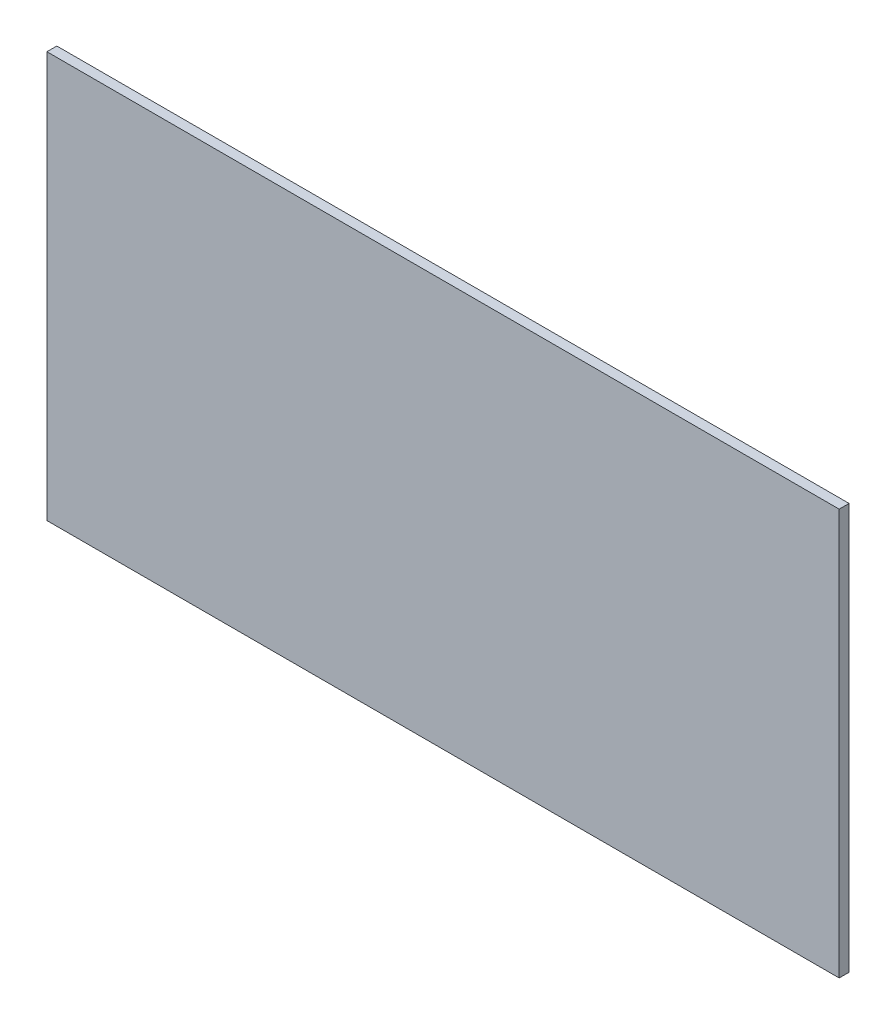
ISO-10303-21;
HEADER;
FILE_DESCRIPTION(('STEP AP214'),'2;1');
FILE_NAME('part.step','',(''),(''),'','','');
FILE_SCHEMA(('AUTOMOTIVE_DESIGN { 1 0 10303 214 1 1 1 1 }'));
ENDSEC;
DATA;
#1=APPLICATION_CONTEXT('core data for automotive mechanical design processes');
#2=APPLICATION_PROTOCOL_DEFINITION('international standard','automotive_design',2000,#1);
#3=PRODUCT_CONTEXT('',#1,'mechanical');
#4=PRODUCT('Part','Part','',(#3));
#5=PRODUCT_RELATED_PRODUCT_CATEGORY('part','',(#4));
#6=PRODUCT_DEFINITION_FORMATION('','',#4);
#7=PRODUCT_DEFINITION_CONTEXT('part definition',#1,'design');
#8=PRODUCT_DEFINITION('design','',#6,#7);
#9=PRODUCT_DEFINITION_SHAPE('','',#8);
#10=(LENGTH_UNIT() NAMED_UNIT(*) SI_UNIT(.MILLI.,.METRE.));
#11=(NAMED_UNIT(*) PLANE_ANGLE_UNIT() SI_UNIT($,.RADIAN.));
#12=(NAMED_UNIT(*) SI_UNIT($,.STERADIAN.) SOLID_ANGLE_UNIT());
#13=UNCERTAINTY_MEASURE_WITH_UNIT(LENGTH_MEASURE(1.E-05),#10,'distance_accuracy_value','');
#14=(GEOMETRIC_REPRESENTATION_CONTEXT(3) GLOBAL_UNCERTAINTY_ASSIGNED_CONTEXT((#13)) GLOBAL_UNIT_ASSIGNED_CONTEXT((#10,
#11,#12)) REPRESENTATION_CONTEXT('',''));
#15=CARTESIAN_POINT('',(0.,0.,0.));
#16=DIRECTION('',(0.,0.,1.));
#17=DIRECTION('',(1.,0.,0.));
#18=AXIS2_PLACEMENT_3D('',#15,#16,#17);
#19=CARTESIAN_POINT('',(0.,0.,10.));
#20=DIRECTION('',(0.,0.,1.));
#21=DIRECTION('',(1.,0.,0.));
#22=AXIS2_PLACEMENT_3D('',#19,#20,#21);
#23=PLANE('',#22);
#24=DIRECTION('',(1.,0.,0.));
#25=VECTOR('',#24,1.);
#26=CARTESIAN_POINT('',(400.,205.,10.));
#27=LINE('',#26,#25);
#28=CARTESIAN_POINT('',(-400.,205.,10.));
#29=VERTEX_POINT('',#28);
#30=CARTESIAN_POINT('',(400.,205.,10.));
#31=VERTEX_POINT('',#30);
#32=EDGE_CURVE('E68',#29,#31,#27,.T.);
#33=ORIENTED_EDGE('',*,*,#32,.F.);
#34=DIRECTION('',(0.,1.,0.));
#35=VECTOR('',#34,1.);
#36=CARTESIAN_POINT('',(-400.,205.,10.));
#37=LINE('',#36,#35);
#38=CARTESIAN_POINT('',(-400.,-205.,10.));
#39=VERTEX_POINT('',#38);
#40=EDGE_CURVE('E20',#39,#29,#37,.T.);
#41=ORIENTED_EDGE('',*,*,#40,.F.);
#42=DIRECTION('',(1.,0.,0.));
#43=VECTOR('',#42,1.);
#44=CARTESIAN_POINT('',(-400.,-205.,10.));
#45=LINE('',#44,#43);
#46=CARTESIAN_POINT('',(400.,-205.,10.));
#47=VERTEX_POINT('',#46);
#48=EDGE_CURVE('E58',#47,#39,#45,.F.);
#49=ORIENTED_EDGE('',*,*,#48,.F.);
#50=DIRECTION('',(0.,1.,0.));
#51=VECTOR('',#50,1.);
#52=CARTESIAN_POINT('',(400.,-205.,10.));
#53=LINE('',#52,#51);
#54=EDGE_CURVE('E53',#31,#47,#53,.F.);
#55=ORIENTED_EDGE('',*,*,#54,.F.);
#56=EDGE_LOOP('',(#33,#41,#49,#55));
#57=FACE_BOUND('',#56,.T.);
#58=ADVANCED_FACE('F17',(#57),#23,.T.);
#59=CARTESIAN_POINT('',(-400.,205.,0.));
#60=DIRECTION('',(-1.,0.,0.));
#61=DIRECTION('',(0.,0.,1.));
#62=AXIS2_PLACEMENT_3D('',#59,#60,#61);
#63=PLANE('',#62);
#64=DIRECTION('',(0.,0.,1.));
#65=VECTOR('',#64,1.);
#66=CARTESIAN_POINT('',(-400.,205.,0.));
#67=LINE('',#66,#65);
#68=CARTESIAN_POINT('',(-400.,205.,0.));
#69=VERTEX_POINT('',#68);
#70=EDGE_CURVE('E79',#69,#29,#67,.T.);
#71=ORIENTED_EDGE('',*,*,#70,.F.);
#72=DIRECTION('',(0.,1.,0.));
#73=VECTOR('',#72,1.);
#74=CARTESIAN_POINT('',(-400.,0.,0.));
#75=LINE('',#74,#73);
#76=CARTESIAN_POINT('',(-400.,-205.,0.));
#77=VERTEX_POINT('',#76);
#78=EDGE_CURVE('E74',#69,#77,#75,.F.);
#79=ORIENTED_EDGE('',*,*,#78,.T.);
#80=DIRECTION('',(0.,0.,-1.));
#81=VECTOR('',#80,1.);
#82=CARTESIAN_POINT('',(-400.,-205.,0.));
#83=LINE('',#82,#81);
#84=EDGE_CURVE('E63',#39,#77,#83,.T.);
#85=ORIENTED_EDGE('',*,*,#84,.F.);
#86=ORIENTED_EDGE('',*,*,#40,.T.);
#87=EDGE_LOOP('',(#71,#79,#85,#86));
#88=FACE_BOUND('',#87,.T.);
#89=ADVANCED_FACE('F73',(#88),#63,.T.);
#90=CARTESIAN_POINT('',(-400.,-205.,0.));
#91=DIRECTION('',(0.,-1.,0.));
#92=DIRECTION('',(0.,0.,-1.));
#93=AXIS2_PLACEMENT_3D('',#90,#91,#92);
#94=PLANE('',#93);
#95=ORIENTED_EDGE('',*,*,#84,.T.);
#96=DIRECTION('',(1.,0.,0.));
#97=VECTOR('',#96,1.);
#98=CARTESIAN_POINT('',(0.,-205.,0.));
#99=LINE('',#98,#97);
#100=CARTESIAN_POINT('',(400.,-205.,0.));
#101=VERTEX_POINT('',#100);
#102=EDGE_CURVE('E84',#77,#101,#99,.T.);
#103=ORIENTED_EDGE('',*,*,#102,.T.);
#104=DIRECTION('',(0.,0.,-1.));
#105=VECTOR('',#104,1.);
#106=CARTESIAN_POINT('',(400.,-205.,0.));
#107=LINE('',#106,#105);
#108=EDGE_CURVE('E65',#47,#101,#107,.T.);
#109=ORIENTED_EDGE('',*,*,#108,.F.);
#110=ORIENTED_EDGE('',*,*,#48,.T.);
#111=EDGE_LOOP('',(#95,#103,#109,#110));
#112=FACE_BOUND('',#111,.T.);
#113=ADVANCED_FACE('F60',(#112),#94,.T.);
#114=CARTESIAN_POINT('',(400.,-205.,0.));
#115=DIRECTION('',(1.,0.,0.));
#116=DIRECTION('',(0.,0.,-1.));
#117=AXIS2_PLACEMENT_3D('',#114,#115,#116);
#118=PLANE('',#117);
#119=ORIENTED_EDGE('',*,*,#108,.T.);
#120=DIRECTION('',(0.,1.,0.));
#121=VECTOR('',#120,1.);
#122=CARTESIAN_POINT('',(400.,0.,0.));
#123=LINE('',#122,#121);
#124=CARTESIAN_POINT('',(400.,205.,0.));
#125=VERTEX_POINT('',#124);
#126=EDGE_CURVE('E26',#101,#125,#123,.T.);
#127=ORIENTED_EDGE('',*,*,#126,.T.);
#128=DIRECTION('',(0.,0.,1.));
#129=VECTOR('',#128,1.);
#130=CARTESIAN_POINT('',(400.,205.,0.));
#131=LINE('',#130,#129);
#132=EDGE_CURVE('E34',#31,#125,#131,.F.);
#133=ORIENTED_EDGE('',*,*,#132,.F.);
#134=ORIENTED_EDGE('',*,*,#54,.T.);
#135=EDGE_LOOP('',(#119,#127,#133,#134));
#136=FACE_BOUND('',#135,.T.);
#137=ADVANCED_FACE('F88',(#136),#118,.T.);
#138=CARTESIAN_POINT('',(400.,205.,0.));
#139=DIRECTION('',(0.,1.,0.));
#140=DIRECTION('',(0.,0.,1.));
#141=AXIS2_PLACEMENT_3D('',#138,#139,#140);
#142=PLANE('',#141);
#143=ORIENTED_EDGE('',*,*,#132,.T.);
#144=DIRECTION('',(1.,0.,0.));
#145=VECTOR('',#144,1.);
#146=CARTESIAN_POINT('',(0.,205.,0.));
#147=LINE('',#146,#145);
#148=EDGE_CURVE('E11',#125,#69,#147,.F.);
#149=ORIENTED_EDGE('',*,*,#148,.T.);
#150=ORIENTED_EDGE('',*,*,#70,.T.);
#151=ORIENTED_EDGE('',*,*,#32,.T.);
#152=EDGE_LOOP('',(#143,#149,#150,#151));
#153=FACE_BOUND('',#152,.T.);
#154=ADVANCED_FACE('F91',(#153),#142,.T.);
#155=CARTESIAN_POINT('',(0.,0.,0.));
#156=DIRECTION('',(0.,0.,1.));
#157=DIRECTION('',(1.,0.,0.));
#158=AXIS2_PLACEMENT_3D('',#155,#156,#157);
#159=PLANE('',#158);
#160=ORIENTED_EDGE('',*,*,#126,.F.);
#161=ORIENTED_EDGE('',*,*,#102,.F.);
#162=ORIENTED_EDGE('',*,*,#78,.F.);
#163=ORIENTED_EDGE('',*,*,#148,.F.);
#164=EDGE_LOOP('',(#160,#161,#162,#163));
#165=FACE_BOUND('',#164,.T.);
#166=ADVANCED_FACE('F90',(#165),#159,.F.);
#167=CLOSED_SHELL('',(#58,#89,#113,#137,#154,#166));
#168=MANIFOLD_SOLID_BREP('B1',#167);
#169=ADVANCED_BREP_SHAPE_REPRESENTATION('',(#18,#168),#14);
#170=SHAPE_DEFINITION_REPRESENTATION(#9,#169);
ENDSEC;
END-ISO-10303-21;
